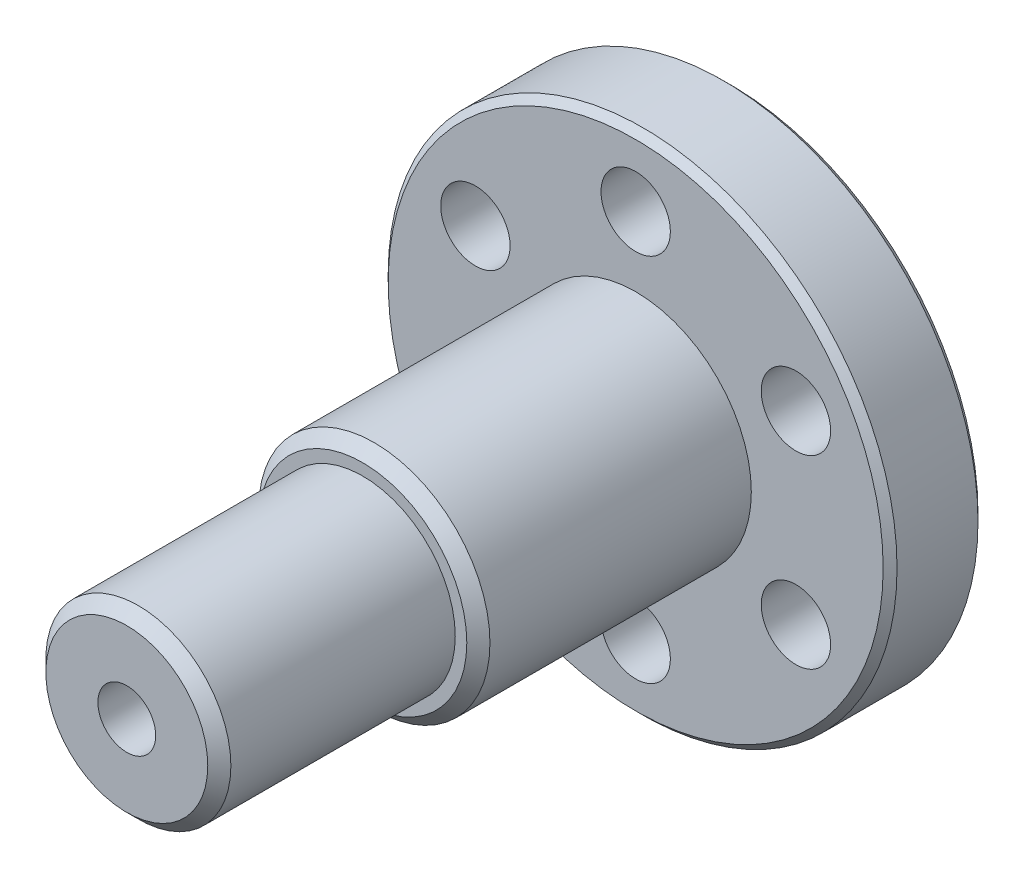
ISO-10303-21;
HEADER;
FILE_DESCRIPTION(('STEP AP214'),'2;1');
FILE_NAME('part.step','',(''),(''),'','','');
FILE_SCHEMA(('AUTOMOTIVE_DESIGN { 1 0 10303 214 1 1 1 1 }'));
ENDSEC;
DATA;
#1=APPLICATION_CONTEXT('core data for automotive mechanical design processes');
#2=APPLICATION_PROTOCOL_DEFINITION('international standard','automotive_design',2000,#1);
#3=PRODUCT_CONTEXT('',#1,'mechanical');
#4=PRODUCT('Part','Part','',(#3));
#5=PRODUCT_RELATED_PRODUCT_CATEGORY('part','',(#4));
#6=PRODUCT_DEFINITION_FORMATION('','',#4);
#7=PRODUCT_DEFINITION_CONTEXT('part definition',#1,'design');
#8=PRODUCT_DEFINITION('design','',#6,#7);
#9=PRODUCT_DEFINITION_SHAPE('','',#8);
#10=(LENGTH_UNIT() NAMED_UNIT(*) SI_UNIT(.MILLI.,.METRE.));
#11=(NAMED_UNIT(*) PLANE_ANGLE_UNIT() SI_UNIT($,.RADIAN.));
#12=(NAMED_UNIT(*) SI_UNIT($,.STERADIAN.) SOLID_ANGLE_UNIT());
#13=UNCERTAINTY_MEASURE_WITH_UNIT(LENGTH_MEASURE(1.E-05),#10,'distance_accuracy_value','');
#14=(GEOMETRIC_REPRESENTATION_CONTEXT(3) GLOBAL_UNCERTAINTY_ASSIGNED_CONTEXT((#13)) GLOBAL_UNIT_ASSIGNED_CONTEXT((#10,
#11,#12)) REPRESENTATION_CONTEXT('',''));
#15=CARTESIAN_POINT('',(0.,0.,0.));
#16=DIRECTION('',(0.,0.,1.));
#17=DIRECTION('',(1.,0.,0.));
#18=AXIS2_PLACEMENT_3D('',#15,#16,#17);
#19=CARTESIAN_POINT('',(0.,0.,26.1));
#20=DIRECTION('',(0.,0.,-1.));
#21=DIRECTION('',(-1.,0.,0.));
#22=AXIS2_PLACEMENT_3D('',#19,#20,#21);
#23=CYLINDRICAL_SURFACE('',#22,5.);
#24=CARTESIAN_POINT('',(0.,0.,15.4));
#25=DIRECTION('',(0.,0.,1.));
#26=DIRECTION('',(1.,0.,0.));
#27=AXIS2_PLACEMENT_3D('',#24,#25,#26);
#28=CIRCLE('',#27,5.);
#29=CARTESIAN_POINT('',(5.,0.,15.4));
#30=VERTEX_POINT('',#29);
#31=EDGE_CURVE('E118',#30,#30,#28,.F.);
#32=ORIENTED_EDGE('',*,*,#31,.T.);
#33=EDGE_LOOP('',(#32));
#34=FACE_BOUND('',#33,.T.);
#35=CARTESIAN_POINT('',(0.,0.,4.1));
#36=DIRECTION('',(0.,0.,1.));
#37=DIRECTION('',(1.,0.,0.));
#38=AXIS2_PLACEMENT_3D('',#35,#36,#37);
#39=CIRCLE('',#38,5.);
#40=CARTESIAN_POINT('',(5.,0.,4.1));
#41=VERTEX_POINT('',#40);
#42=EDGE_CURVE('E72',#41,#41,#39,.T.);
#43=ORIENTED_EDGE('',*,*,#42,.T.);
#44=EDGE_LOOP('',(#43));
#45=FACE_BOUND('',#44,.T.);
#46=ADVANCED_FACE('F47',(#34,#45),#23,.T.);
#47=CARTESIAN_POINT('',(0.,0.,4.1));
#48=DIRECTION('',(0.,0.,1.));
#49=DIRECTION('',(1.,0.,0.));
#50=AXIS2_PLACEMENT_3D('',#47,#48,#49);
#51=PLANE('',#50);
#52=CARTESIAN_POINT('',(0.,0.,4.1));
#53=DIRECTION('',(0.,0.,1.));
#54=DIRECTION('',(1.,0.,0.));
#55=AXIS2_PLACEMENT_3D('',#52,#53,#54);
#56=CIRCLE('',#55,10.7);
#57=CARTESIAN_POINT('',(10.7,0.,4.1));
#58=VERTEX_POINT('',#57);
#59=EDGE_CURVE('E127',#58,#58,#56,.T.);
#60=ORIENTED_EDGE('',*,*,#59,.T.);
#61=EDGE_LOOP('',(#60));
#62=FACE_BOUND('',#61,.T.);
#63=ORIENTED_EDGE('',*,*,#42,.F.);
#64=EDGE_LOOP('',(#63));
#65=FACE_BOUND('',#64,.T.);
#66=CARTESIAN_POINT('',(-6.92820323027551,-4.,4.1));
#67=DIRECTION('',(0.,0.,1.));
#68=DIRECTION('',(1.,0.,0.));
#69=AXIS2_PLACEMENT_3D('',#66,#67,#68);
#70=CIRCLE('',#69,1.5);
#71=CARTESIAN_POINT('',(-5.42820323027551,-4.,4.1));
#72=VERTEX_POINT('',#71);
#73=EDGE_CURVE('E86',#72,#72,#70,.T.);
#74=ORIENTED_EDGE('',*,*,#73,.F.);
#75=EDGE_LOOP('',(#74));
#76=FACE_BOUND('',#75,.T.);
#77=CARTESIAN_POINT('',(6.92820323027551,-4.,4.1));
#78=DIRECTION('',(0.,0.,1.));
#79=DIRECTION('',(1.,0.,0.));
#80=AXIS2_PLACEMENT_3D('',#77,#78,#79);
#81=CIRCLE('',#80,1.5);
#82=CARTESIAN_POINT('',(8.42820323027551,-4.,4.1));
#83=VERTEX_POINT('',#82);
#84=EDGE_CURVE('E98',#83,#83,#81,.T.);
#85=ORIENTED_EDGE('',*,*,#84,.F.);
#86=EDGE_LOOP('',(#85));
#87=FACE_BOUND('',#86,.T.);
#88=CARTESIAN_POINT('',(0.,8.,4.1));
#89=DIRECTION('',(0.,0.,1.));
#90=DIRECTION('',(1.,0.,0.));
#91=AXIS2_PLACEMENT_3D('',#88,#89,#90);
#92=CIRCLE('',#91,1.5);
#93=CARTESIAN_POINT('',(1.5,8.,4.1));
#94=VERTEX_POINT('',#93);
#95=EDGE_CURVE('E110',#94,#94,#92,.T.);
#96=ORIENTED_EDGE('',*,*,#95,.F.);
#97=EDGE_LOOP('',(#96));
#98=FACE_BOUND('',#97,.T.);
#99=CARTESIAN_POINT('',(6.92820323027551,4.,4.1));
#100=DIRECTION('',(0.,0.,1.));
#101=DIRECTION('',(1.,0.,0.));
#102=AXIS2_PLACEMENT_3D('',#99,#100,#101);
#103=CIRCLE('',#102,1.5);
#104=CARTESIAN_POINT('',(8.42820323027551,4.,4.1));
#105=VERTEX_POINT('',#104);
#106=EDGE_CURVE('E104',#105,#105,#103,.T.);
#107=ORIENTED_EDGE('',*,*,#106,.F.);
#108=EDGE_LOOP('',(#107));
#109=FACE_BOUND('',#108,.T.);
#110=CARTESIAN_POINT('',(0.,-8.,4.1));
#111=DIRECTION('',(0.,0.,1.));
#112=DIRECTION('',(1.,0.,0.));
#113=AXIS2_PLACEMENT_3D('',#110,#111,#112);
#114=CIRCLE('',#113,1.5);
#115=CARTESIAN_POINT('',(1.5,-8.,4.1));
#116=VERTEX_POINT('',#115);
#117=EDGE_CURVE('E92',#116,#116,#114,.T.);
#118=ORIENTED_EDGE('',*,*,#117,.F.);
#119=EDGE_LOOP('',(#118));
#120=FACE_BOUND('',#119,.T.);
#121=CARTESIAN_POINT('',(-6.92820323027551,3.99999999999999,4.1));
#122=DIRECTION('',(0.,0.,1.));
#123=DIRECTION('',(1.,0.,0.));
#124=AXIS2_PLACEMENT_3D('',#121,#122,#123);
#125=CIRCLE('',#124,1.5);
#126=CARTESIAN_POINT('',(-5.42820323027551,3.99999999999999,4.1));
#127=VERTEX_POINT('',#126);
#128=EDGE_CURVE('E80',#127,#127,#125,.T.);
#129=ORIENTED_EDGE('',*,*,#128,.F.);
#130=EDGE_LOOP('',(#129));
#131=FACE_BOUND('',#130,.T.);
#132=ADVANCED_FACE('F143',(#62,#65,#76,#87,#98,#109,#120,#131),#51,.T.);
#133=CARTESIAN_POINT('',(0.,0.,0.));
#134=DIRECTION('',(0.,0.,1.));
#135=DIRECTION('',(1.,0.,0.));
#136=AXIS2_PLACEMENT_3D('',#133,#134,#135);
#137=PLANE('',#136);
#138=CARTESIAN_POINT('',(0.,0.,0.));
#139=DIRECTION('',(0.,0.,1.));
#140=DIRECTION('',(1.,0.,0.));
#141=AXIS2_PLACEMENT_3D('',#138,#139,#140);
#142=CIRCLE('',#141,10.7);
#143=CARTESIAN_POINT('',(10.7,0.,0.));
#144=VERTEX_POINT('',#143);
#145=EDGE_CURVE('E13',#144,#144,#142,.F.);
#146=ORIENTED_EDGE('',*,*,#145,.T.);
#147=EDGE_LOOP('',(#146));
#148=FACE_BOUND('',#147,.T.);
#149=CARTESIAN_POINT('',(0.,8.,0.));
#150=DIRECTION('',(0.,0.,1.));
#151=DIRECTION('',(1.,0.,0.));
#152=AXIS2_PLACEMENT_3D('',#149,#150,#151);
#153=CIRCLE('',#152,1.5);
#154=CARTESIAN_POINT('',(1.5,8.,0.));
#155=VERTEX_POINT('',#154);
#156=EDGE_CURVE('E107',#155,#155,#153,.T.);
#157=ORIENTED_EDGE('',*,*,#156,.T.);
#158=EDGE_LOOP('',(#157));
#159=FACE_BOUND('',#158,.T.);
#160=CARTESIAN_POINT('',(6.92820323027551,4.,0.));
#161=DIRECTION('',(0.,0.,1.));
#162=DIRECTION('',(1.,0.,0.));
#163=AXIS2_PLACEMENT_3D('',#160,#161,#162);
#164=CIRCLE('',#163,1.5);
#165=CARTESIAN_POINT('',(8.42820323027551,4.,0.));
#166=VERTEX_POINT('',#165);
#167=EDGE_CURVE('E101',#166,#166,#164,.T.);
#168=ORIENTED_EDGE('',*,*,#167,.T.);
#169=EDGE_LOOP('',(#168));
#170=FACE_BOUND('',#169,.T.);
#171=CARTESIAN_POINT('',(6.92820323027551,-4.,0.));
#172=DIRECTION('',(0.,0.,1.));
#173=DIRECTION('',(1.,0.,0.));
#174=AXIS2_PLACEMENT_3D('',#171,#172,#173);
#175=CIRCLE('',#174,1.5);
#176=CARTESIAN_POINT('',(8.42820323027551,-4.,0.));
#177=VERTEX_POINT('',#176);
#178=EDGE_CURVE('E95',#177,#177,#175,.T.);
#179=ORIENTED_EDGE('',*,*,#178,.T.);
#180=EDGE_LOOP('',(#179));
#181=FACE_BOUND('',#180,.T.);
#182=CARTESIAN_POINT('',(0.,-8.,0.));
#183=DIRECTION('',(0.,0.,1.));
#184=DIRECTION('',(1.,0.,0.));
#185=AXIS2_PLACEMENT_3D('',#182,#183,#184);
#186=CIRCLE('',#185,1.5);
#187=CARTESIAN_POINT('',(1.5,-8.,0.));
#188=VERTEX_POINT('',#187);
#189=EDGE_CURVE('E89',#188,#188,#186,.T.);
#190=ORIENTED_EDGE('',*,*,#189,.T.);
#191=EDGE_LOOP('',(#190));
#192=FACE_BOUND('',#191,.T.);
#193=CARTESIAN_POINT('',(-6.92820323027551,-4.,0.));
#194=DIRECTION('',(0.,0.,1.));
#195=DIRECTION('',(1.,0.,0.));
#196=AXIS2_PLACEMENT_3D('',#193,#194,#195);
#197=CIRCLE('',#196,1.5);
#198=CARTESIAN_POINT('',(-5.42820323027551,-4.,0.));
#199=VERTEX_POINT('',#198);
#200=EDGE_CURVE('E83',#199,#199,#197,.T.);
#201=ORIENTED_EDGE('',*,*,#200,.T.);
#202=EDGE_LOOP('',(#201));
#203=FACE_BOUND('',#202,.T.);
#204=CARTESIAN_POINT('',(-6.92820323027551,3.99999999999999,0.));
#205=DIRECTION('',(0.,0.,1.));
#206=DIRECTION('',(1.,0.,0.));
#207=AXIS2_PLACEMENT_3D('',#204,#205,#206);
#208=CIRCLE('',#207,1.5);
#209=CARTESIAN_POINT('',(-5.42820323027551,3.99999999999999,0.));
#210=VERTEX_POINT('',#209);
#211=EDGE_CURVE('E79',#210,#210,#208,.T.);
#212=ORIENTED_EDGE('',*,*,#211,.T.);
#213=EDGE_LOOP('',(#212));
#214=FACE_BOUND('',#213,.T.);
#215=ADVANCED_FACE('F146',(#148,#159,#170,#181,#192,#203,#214),#137,.F.);
#216=CARTESIAN_POINT('',(0.,0.,4.1));
#217=DIRECTION('',(0.,0.,-1.));
#218=DIRECTION('',(-1.,0.,0.));
#219=AXIS2_PLACEMENT_3D('',#216,#217,#218);
#220=CYLINDRICAL_SURFACE('',#219,11.);
#221=CARTESIAN_POINT('',(0.,0.,3.8));
#222=DIRECTION('',(0.,0.,1.));
#223=DIRECTION('',(1.,0.,0.));
#224=AXIS2_PLACEMENT_3D('',#221,#222,#223);
#225=CIRCLE('',#224,11.);
#226=CARTESIAN_POINT('',(11.,0.,3.8));
#227=VERTEX_POINT('',#226);
#228=EDGE_CURVE('E55',#227,#227,#225,.F.);
#229=ORIENTED_EDGE('',*,*,#228,.T.);
#230=EDGE_LOOP('',(#229));
#231=FACE_BOUND('',#230,.T.);
#232=CARTESIAN_POINT('',(0.,0.,0.299999999999995));
#233=DIRECTION('',(0.,0.,1.));
#234=DIRECTION('',(1.,0.,0.));
#235=AXIS2_PLACEMENT_3D('',#232,#233,#234);
#236=CIRCLE('',#235,11.);
#237=CARTESIAN_POINT('',(11.,0.,0.299999999999995));
#238=VERTEX_POINT('',#237);
#239=EDGE_CURVE('E130',#238,#238,#236,.T.);
#240=ORIENTED_EDGE('',*,*,#239,.T.);
#241=EDGE_LOOP('',(#240));
#242=FACE_BOUND('',#241,.T.);
#243=ADVANCED_FACE('F135',(#231,#242),#220,.T.);
#244=CARTESIAN_POINT('',(0.,8.,4.1));
#245=DIRECTION('',(0.,0.,-1.));
#246=DIRECTION('',(-1.,0.,0.));
#247=AXIS2_PLACEMENT_3D('',#244,#245,#246);
#248=CYLINDRICAL_SURFACE('',#247,1.5);
#249=ORIENTED_EDGE('',*,*,#95,.T.);
#250=EDGE_LOOP('',(#249));
#251=FACE_BOUND('',#250,.T.);
#252=ORIENTED_EDGE('',*,*,#156,.F.);
#253=EDGE_LOOP('',(#252));
#254=FACE_BOUND('',#253,.T.);
#255=ADVANCED_FACE('F176',(#251,#254),#248,.F.);
#256=CARTESIAN_POINT('',(6.92820323027551,4.,4.1));
#257=DIRECTION('',(0.,0.,-1.));
#258=DIRECTION('',(-1.,0.,0.));
#259=AXIS2_PLACEMENT_3D('',#256,#257,#258);
#260=CYLINDRICAL_SURFACE('',#259,1.5);
#261=ORIENTED_EDGE('',*,*,#106,.T.);
#262=EDGE_LOOP('',(#261));
#263=FACE_BOUND('',#262,.T.);
#264=ORIENTED_EDGE('',*,*,#167,.F.);
#265=EDGE_LOOP('',(#264));
#266=FACE_BOUND('',#265,.T.);
#267=ADVANCED_FACE('F199',(#263,#266),#260,.F.);
#268=CARTESIAN_POINT('',(6.92820323027551,-4.,4.1));
#269=DIRECTION('',(0.,0.,-1.));
#270=DIRECTION('',(-1.,0.,0.));
#271=AXIS2_PLACEMENT_3D('',#268,#269,#270);
#272=CYLINDRICAL_SURFACE('',#271,1.5);
#273=ORIENTED_EDGE('',*,*,#84,.T.);
#274=EDGE_LOOP('',(#273));
#275=FACE_BOUND('',#274,.T.);
#276=ORIENTED_EDGE('',*,*,#178,.F.);
#277=EDGE_LOOP('',(#276));
#278=FACE_BOUND('',#277,.T.);
#279=ADVANCED_FACE('F195',(#275,#278),#272,.F.);
#280=CARTESIAN_POINT('',(0.,-8.,4.1));
#281=DIRECTION('',(0.,0.,-1.));
#282=DIRECTION('',(-1.,0.,0.));
#283=AXIS2_PLACEMENT_3D('',#280,#281,#282);
#284=CYLINDRICAL_SURFACE('',#283,1.5);
#285=ORIENTED_EDGE('',*,*,#117,.T.);
#286=EDGE_LOOP('',(#285));
#287=FACE_BOUND('',#286,.T.);
#288=ORIENTED_EDGE('',*,*,#189,.F.);
#289=EDGE_LOOP('',(#288));
#290=FACE_BOUND('',#289,.T.);
#291=ADVANCED_FACE('F191',(#287,#290),#284,.F.);
#292=CARTESIAN_POINT('',(-6.92820323027551,-4.,4.1));
#293=DIRECTION('',(0.,0.,-1.));
#294=DIRECTION('',(-1.,0.,0.));
#295=AXIS2_PLACEMENT_3D('',#292,#293,#294);
#296=CYLINDRICAL_SURFACE('',#295,1.5);
#297=ORIENTED_EDGE('',*,*,#73,.T.);
#298=EDGE_LOOP('',(#297));
#299=FACE_BOUND('',#298,.T.);
#300=ORIENTED_EDGE('',*,*,#200,.F.);
#301=EDGE_LOOP('',(#300));
#302=FACE_BOUND('',#301,.T.);
#303=ADVANCED_FACE('F166',(#299,#302),#296,.F.);
#304=CARTESIAN_POINT('',(-6.92820323027551,3.99999999999999,4.1));
#305=DIRECTION('',(0.,0.,-1.));
#306=DIRECTION('',(-1.,0.,0.));
#307=AXIS2_PLACEMENT_3D('',#304,#305,#306);
#308=CYLINDRICAL_SURFACE('',#307,1.5);
#309=ORIENTED_EDGE('',*,*,#128,.T.);
#310=EDGE_LOOP('',(#309));
#311=FACE_BOUND('',#310,.T.);
#312=ORIENTED_EDGE('',*,*,#211,.F.);
#313=EDGE_LOOP('',(#312));
#314=FACE_BOUND('',#313,.T.);
#315=ADVANCED_FACE('F162',(#311,#314),#308,.F.);
#316=CARTESIAN_POINT('',(0.,0.,15.9));
#317=DIRECTION('',(0.,0.,1.));
#318=DIRECTION('',(1.,0.,0.));
#319=AXIS2_PLACEMENT_3D('',#316,#317,#318);
#320=PLANE('',#319);
#321=CARTESIAN_POINT('',(0.,0.,15.9));
#322=DIRECTION('',(0.,0.,1.));
#323=DIRECTION('',(1.,0.,0.));
#324=AXIS2_PLACEMENT_3D('',#321,#322,#323);
#325=CIRCLE('',#324,4.50000000000001);
#326=CARTESIAN_POINT('',(4.50000000000001,0.,15.9));
#327=VERTEX_POINT('',#326);
#328=EDGE_CURVE('E113',#327,#327,#325,.T.);
#329=ORIENTED_EDGE('',*,*,#328,.T.);
#330=EDGE_LOOP('',(#329));
#331=FACE_BOUND('',#330,.T.);
#332=CARTESIAN_POINT('',(0.,0.,15.9));
#333=DIRECTION('',(0.,0.,1.));
#334=DIRECTION('',(1.,0.,0.));
#335=AXIS2_PLACEMENT_3D('',#332,#333,#334);
#336=CIRCLE('',#335,4.);
#337=CARTESIAN_POINT('',(4.,0.,15.9));
#338=VERTEX_POINT('',#337);
#339=EDGE_CURVE('E68',#338,#338,#336,.F.);
#340=ORIENTED_EDGE('',*,*,#339,.T.);
#341=EDGE_LOOP('',(#340));
#342=FACE_BOUND('',#341,.T.);
#343=ADVANCED_FACE('F165',(#331,#342),#320,.T.);
#344=CARTESIAN_POINT('',(0.,0.,-27.3238253559302));
#345=DIRECTION('',(0.,0.,1.));
#346=DIRECTION('',(1.,0.,0.));
#347=AXIS2_PLACEMENT_3D('',#344,#345,#346);
#348=CYLINDRICAL_SURFACE('',#347,4.);
#349=CARTESIAN_POINT('',(0.,0.,25.6));
#350=DIRECTION('',(0.,0.,1.));
#351=DIRECTION('',(1.,0.,0.));
#352=AXIS2_PLACEMENT_3D('',#349,#350,#351);
#353=CIRCLE('',#352,4.);
#354=CARTESIAN_POINT('',(4.,0.,25.6));
#355=VERTEX_POINT('',#354);
#356=EDGE_CURVE('E124',#355,#355,#353,.F.);
#357=ORIENTED_EDGE('',*,*,#356,.T.);
#358=EDGE_LOOP('',(#357));
#359=FACE_BOUND('',#358,.T.);
#360=ORIENTED_EDGE('',*,*,#339,.F.);
#361=EDGE_LOOP('',(#360));
#362=FACE_BOUND('',#361,.T.);
#363=ADVANCED_FACE('F250',(#359,#362),#348,.T.);
#364=CARTESIAN_POINT('',(0.,0.,26.1));
#365=DIRECTION('',(0.,0.,1.));
#366=DIRECTION('',(1.,0.,0.));
#367=AXIS2_PLACEMENT_3D('',#364,#365,#366);
#368=PLANE('',#367);
#369=CARTESIAN_POINT('',(0.,0.,26.1));
#370=DIRECTION('',(0.,0.,1.));
#371=DIRECTION('',(1.,0.,0.));
#372=AXIS2_PLACEMENT_3D('',#369,#370,#371);
#373=CIRCLE('',#372,1.25);
#374=CARTESIAN_POINT('',(1.25,0.,26.1));
#375=VERTEX_POINT('',#374);
#376=EDGE_CURVE('E69',#375,#375,#373,.T.);
#377=ORIENTED_EDGE('',*,*,#376,.F.);
#378=EDGE_LOOP('',(#377));
#379=FACE_BOUND('',#378,.T.);
#380=CARTESIAN_POINT('',(0.,0.,26.1));
#381=DIRECTION('',(0.,0.,1.));
#382=DIRECTION('',(1.,0.,0.));
#383=AXIS2_PLACEMENT_3D('',#380,#381,#382);
#384=CIRCLE('',#383,3.5);
#385=CARTESIAN_POINT('',(3.5,0.,26.1));
#386=VERTEX_POINT('',#385);
#387=EDGE_CURVE('E121',#386,#386,#384,.T.);
#388=ORIENTED_EDGE('',*,*,#387,.T.);
#389=EDGE_LOOP('',(#388));
#390=FACE_BOUND('',#389,.T.);
#391=ADVANCED_FACE('F186',(#379,#390),#368,.T.);
#392=CARTESIAN_POINT('',(0.,0.,15.9));
#393=DIRECTION('',(0.,0.,-1.));
#394=DIRECTION('',(-1.,0.,0.));
#395=AXIS2_PLACEMENT_3D('',#392,#393,#394);
#396=CONICAL_SURFACE('',#395,4.50000000000001,0.785398163397444);
#397=ORIENTED_EDGE('',*,*,#31,.F.);
#398=EDGE_LOOP('',(#397));
#399=FACE_BOUND('',#398,.T.);
#400=ORIENTED_EDGE('',*,*,#328,.F.);
#401=EDGE_LOOP('',(#400));
#402=FACE_BOUND('',#401,.T.);
#403=ADVANCED_FACE('F265',(#399,#402),#396,.T.);
#404=CARTESIAN_POINT('',(0.,0.,26.1));
#405=DIRECTION('',(0.,0.,-1.));
#406=DIRECTION('',(-1.,0.,0.));
#407=AXIS2_PLACEMENT_3D('',#404,#405,#406);
#408=CONICAL_SURFACE('',#407,3.5,0.785398163397441);
#409=ORIENTED_EDGE('',*,*,#356,.F.);
#410=EDGE_LOOP('',(#409));
#411=FACE_BOUND('',#410,.T.);
#412=ORIENTED_EDGE('',*,*,#387,.F.);
#413=EDGE_LOOP('',(#412));
#414=FACE_BOUND('',#413,.T.);
#415=ADVANCED_FACE('F62',(#411,#414),#408,.T.);
#416=CARTESIAN_POINT('',(0.,0.,16.6));
#417=DIRECTION('',(0.,0.,1.));
#418=DIRECTION('',(1.,0.,0.));
#419=AXIS2_PLACEMENT_3D('',#416,#417,#418);
#420=CONICAL_SURFACE('',#419,1.25,1.02974425867665);
#421=CARTESIAN_POINT('',(0.,0.,15.8489242262155));
#422=VERTEX_POINT('',#421);
#423=VERTEX_LOOP('',#422);
#424=FACE_BOUND('',#423,.T.);
#425=CARTESIAN_POINT('',(0.,0.,16.6));
#426=DIRECTION('',(0.,0.,1.));
#427=DIRECTION('',(1.,0.,0.));
#428=AXIS2_PLACEMENT_3D('',#425,#426,#427);
#429=CIRCLE('',#428,1.25);
#430=CARTESIAN_POINT('',(1.25,0.,16.6));
#431=VERTEX_POINT('',#430);
#432=EDGE_CURVE('E66',#431,#431,#429,.T.);
#433=ORIENTED_EDGE('',*,*,#432,.T.);
#434=EDGE_LOOP('',(#433));
#435=FACE_BOUND('',#434,.T.);
#436=ADVANCED_FACE('F58',(#424,#435),#420,.F.);
#437=CARTESIAN_POINT('',(0.,0.,26.1));
#438=DIRECTION('',(0.,0.,1.));
#439=DIRECTION('',(1.,0.,0.));
#440=AXIS2_PLACEMENT_3D('',#437,#438,#439);
#441=CYLINDRICAL_SURFACE('',#440,1.25);
#442=ORIENTED_EDGE('',*,*,#432,.F.);
#443=EDGE_LOOP('',(#442));
#444=FACE_BOUND('',#443,.T.);
#445=ORIENTED_EDGE('',*,*,#376,.T.);
#446=EDGE_LOOP('',(#445));
#447=FACE_BOUND('',#446,.T.);
#448=ADVANCED_FACE('F61',(#444,#447),#441,.F.);
#449=CARTESIAN_POINT('',(0.,0.,4.1));
#450=DIRECTION('',(0.,0.,-1.));
#451=DIRECTION('',(-1.,0.,0.));
#452=AXIS2_PLACEMENT_3D('',#449,#450,#451);
#453=CONICAL_SURFACE('',#452,10.7,0.785398163397448);
#454=ORIENTED_EDGE('',*,*,#228,.F.);
#455=EDGE_LOOP('',(#454));
#456=FACE_BOUND('',#455,.T.);
#457=ORIENTED_EDGE('',*,*,#59,.F.);
#458=EDGE_LOOP('',(#457));
#459=FACE_BOUND('',#458,.T.);
#460=ADVANCED_FACE('F138',(#456,#459),#453,.T.);
#461=CARTESIAN_POINT('',(0.,0.,0.299999999999995));
#462=DIRECTION('',(0.,0.,1.));
#463=DIRECTION('',(1.,0.,0.));
#464=AXIS2_PLACEMENT_3D('',#461,#462,#463);
#465=CONICAL_SURFACE('',#464,11.,0.785398163397448);
#466=ORIENTED_EDGE('',*,*,#145,.F.);
#467=EDGE_LOOP('',(#466));
#468=FACE_BOUND('',#467,.T.);
#469=ORIENTED_EDGE('',*,*,#239,.F.);
#470=EDGE_LOOP('',(#469));
#471=FACE_BOUND('',#470,.T.);
#472=ADVANCED_FACE('F50',(#468,#471),#465,.T.);
#473=CLOSED_SHELL('',(#46,#132,#215,#243,#255,#267,#279,#291,#303,#315,#343,#363,#391,#403,#415,
#436,#448,#460,#472));
#474=MANIFOLD_SOLID_BREP('B2',#473);
#475=ADVANCED_BREP_SHAPE_REPRESENTATION('',(#18,#474),#14);
#476=SHAPE_DEFINITION_REPRESENTATION(#9,#475);
ENDSEC;
END-ISO-10303-21;
